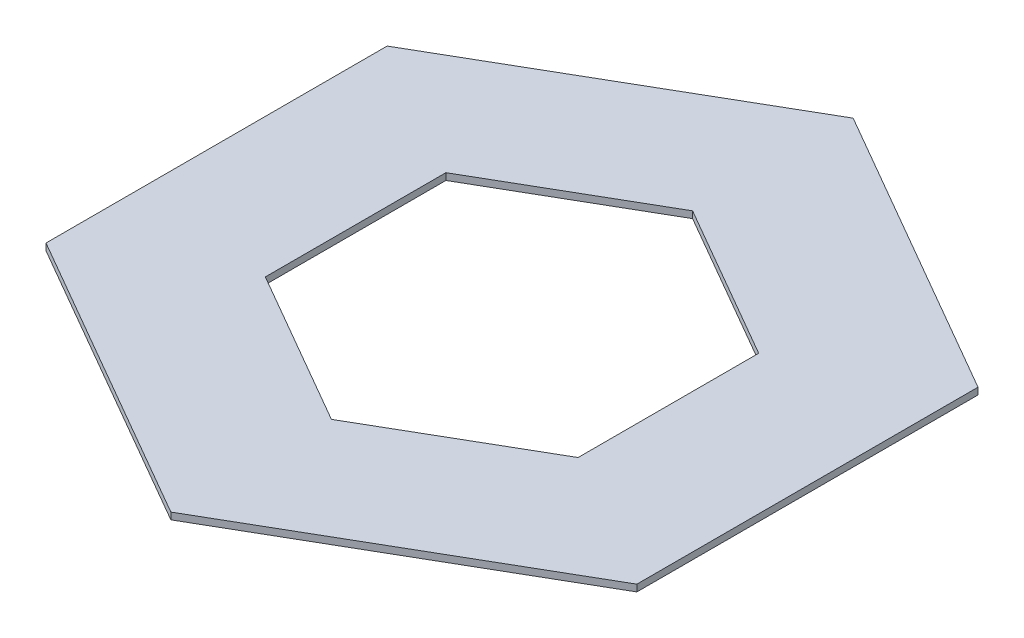
ISO-10303-21;
HEADER;
FILE_DESCRIPTION(('STEP AP214'),'2;1');
FILE_NAME('part.step','',(''),(''),'','','');
FILE_SCHEMA(('AUTOMOTIVE_DESIGN { 1 0 10303 214 1 1 1 1 }'));
ENDSEC;
DATA;
#1=APPLICATION_CONTEXT('core data for automotive mechanical design processes');
#2=APPLICATION_PROTOCOL_DEFINITION('international standard','automotive_design',2000,#1);
#3=PRODUCT_CONTEXT('',#1,'mechanical');
#4=PRODUCT('Part','Part','',(#3));
#5=PRODUCT_RELATED_PRODUCT_CATEGORY('part','',(#4));
#6=PRODUCT_DEFINITION_FORMATION('','',#4);
#7=PRODUCT_DEFINITION_CONTEXT('part definition',#1,'design');
#8=PRODUCT_DEFINITION('design','',#6,#7);
#9=PRODUCT_DEFINITION_SHAPE('','',#8);
#10=(LENGTH_UNIT() NAMED_UNIT(*) SI_UNIT(.MILLI.,.METRE.));
#11=(NAMED_UNIT(*) PLANE_ANGLE_UNIT() SI_UNIT($,.RADIAN.));
#12=(NAMED_UNIT(*) SI_UNIT($,.STERADIAN.) SOLID_ANGLE_UNIT());
#13=UNCERTAINTY_MEASURE_WITH_UNIT(LENGTH_MEASURE(1.E-05),#10,'distance_accuracy_value','');
#14=(GEOMETRIC_REPRESENTATION_CONTEXT(3) GLOBAL_UNCERTAINTY_ASSIGNED_CONTEXT((#13)) GLOBAL_UNIT_ASSIGNED_CONTEXT((#10,
#11,#12)) REPRESENTATION_CONTEXT('',''));
#15=CARTESIAN_POINT('',(0.,0.,0.));
#16=DIRECTION('',(0.,0.,1.));
#17=DIRECTION('',(1.,0.,0.));
#18=AXIS2_PLACEMENT_3D('',#15,#16,#17);
#19=CARTESIAN_POINT('',(-12.2247627531244,1.,-43.3100674178072));
#20=DIRECTION('',(0.5,0.,0.866025403784439));
#21=DIRECTION('',(0.866025403784439,0.,-0.5));
#22=AXIS2_PLACEMENT_3D('',#19,#20,#21);
#23=PLANE('',#22);
#24=DIRECTION('',(-0.866025403784439,0.,0.5));
#25=VECTOR('',#24,1.);
#26=CARTESIAN_POINT('',(-12.2247627531244,0.,-43.3100674178072));
#27=LINE('',#26,#25);
#28=CARTESIAN_POINT('',(0.,0.,-50.3680374841029));
#29=VERTEX_POINT('',#28);
#30=CARTESIAN_POINT('',(-43.62,0.,-25.1840187420514));
#31=VERTEX_POINT('',#30);
#32=EDGE_CURVE('E190',#29,#31,#27,.T.);
#33=ORIENTED_EDGE('',*,*,#32,.T.);
#34=DIRECTION('',(0.,-1.,0.));
#35=VECTOR('',#34,1.);
#36=CARTESIAN_POINT('',(-43.62,1.,-25.1840187420514));
#37=LINE('',#36,#35);
#38=CARTESIAN_POINT('',(-43.62,1.,-25.1840187420514));
#39=VERTEX_POINT('',#38);
#40=EDGE_CURVE('E11',#39,#31,#37,.T.);
#41=ORIENTED_EDGE('',*,*,#40,.F.);
#42=DIRECTION('',(-0.866025403784438,0.,0.5));
#43=VECTOR('',#42,1.);
#44=CARTESIAN_POINT('',(-12.2247627531244,1.,-43.3100674178072));
#45=LINE('',#44,#43);
#46=CARTESIAN_POINT('',(0.,1.,-50.3680374841029));
#47=VERTEX_POINT('',#46);
#48=EDGE_CURVE('E202',#47,#39,#45,.T.);
#49=ORIENTED_EDGE('',*,*,#48,.F.);
#50=DIRECTION('',(0.,-1.,0.));
#51=VECTOR('',#50,1.);
#52=CARTESIAN_POINT('',(0.,1.,-50.3680374841029));
#53=LINE('',#52,#51);
#54=EDGE_CURVE('E221',#47,#29,#53,.T.);
#55=ORIENTED_EDGE('',*,*,#54,.T.);
#56=EDGE_LOOP('',(#33,#41,#49,#55));
#57=FACE_BOUND('',#56,.T.);
#58=ADVANCED_FACE('F42',(#57),#23,.F.);
#59=CARTESIAN_POINT('',(-43.62,1.,-11.06807860946));
#60=DIRECTION('',(1.,0.,0.));
#61=DIRECTION('',(0.,0.,-1.));
#62=AXIS2_PLACEMENT_3D('',#59,#60,#61);
#63=PLANE('',#62);
#64=DIRECTION('',(0.,0.,1.));
#65=VECTOR('',#64,1.);
#66=CARTESIAN_POINT('',(-43.62,0.,-11.06807860946));
#67=LINE('',#66,#65);
#68=CARTESIAN_POINT('',(-43.62,0.,25.1840187420515));
#69=VERTEX_POINT('',#68);
#70=EDGE_CURVE('E225',#31,#69,#67,.T.);
#71=ORIENTED_EDGE('',*,*,#70,.T.);
#72=DIRECTION('',(0.,-1.,0.));
#73=VECTOR('',#72,1.);
#74=CARTESIAN_POINT('',(-43.62,1.,25.1840187420515));
#75=LINE('',#74,#73);
#76=CARTESIAN_POINT('',(-43.62,1.,25.1840187420515));
#77=VERTEX_POINT('',#76);
#78=EDGE_CURVE('E50',#77,#69,#75,.T.);
#79=ORIENTED_EDGE('',*,*,#78,.F.);
#80=DIRECTION('',(0.,0.,1.));
#81=VECTOR('',#80,1.);
#82=CARTESIAN_POINT('',(-43.62,1.,-11.06807860946));
#83=LINE('',#82,#81);
#84=EDGE_CURVE('E205',#39,#77,#83,.T.);
#85=ORIENTED_EDGE('',*,*,#84,.F.);
#86=ORIENTED_EDGE('',*,*,#40,.T.);
#87=EDGE_LOOP('',(#71,#79,#85,#86));
#88=FACE_BOUND('',#87,.T.);
#89=ADVANCED_FACE('F267',(#88),#63,.F.);
#90=CARTESIAN_POINT('',(-31.3952372468755,1.,32.2419888083473));
#91=DIRECTION('',(0.5,0.,-0.866025403784439));
#92=DIRECTION('',(-0.866025403784439,0.,-0.5));
#93=AXIS2_PLACEMENT_3D('',#90,#91,#92);
#94=PLANE('',#93);
#95=DIRECTION('',(0.866025403784439,0.,0.5));
#96=VECTOR('',#95,1.);
#97=CARTESIAN_POINT('',(-31.3952372468755,0.,32.2419888083473));
#98=LINE('',#97,#96);
#99=CARTESIAN_POINT('',(0.,0.,50.368037484103));
#100=VERTEX_POINT('',#99);
#101=EDGE_CURVE('E229',#69,#100,#98,.T.);
#102=ORIENTED_EDGE('',*,*,#101,.T.);
#103=DIRECTION('',(0.,-1.,0.));
#104=VECTOR('',#103,1.);
#105=CARTESIAN_POINT('',(0.,1.,50.368037484103));
#106=LINE('',#105,#104);
#107=CARTESIAN_POINT('',(0.,1.,50.368037484103));
#108=VERTEX_POINT('',#107);
#109=EDGE_CURVE('E255',#108,#100,#106,.T.);
#110=ORIENTED_EDGE('',*,*,#109,.F.);
#111=DIRECTION('',(0.866025403784439,0.,0.5));
#112=VECTOR('',#111,1.);
#113=CARTESIAN_POINT('',(-31.3952372468755,1.,32.2419888083473));
#114=LINE('',#113,#112);
#115=EDGE_CURVE('E209',#77,#108,#114,.T.);
#116=ORIENTED_EDGE('',*,*,#115,.F.);
#117=ORIENTED_EDGE('',*,*,#78,.T.);
#118=EDGE_LOOP('',(#102,#110,#116,#117));
#119=FACE_BOUND('',#118,.T.);
#120=ADVANCED_FACE('F263',(#119),#94,.F.);
#121=CARTESIAN_POINT('',(12.2247627531247,1.,43.3100674178072));
#122=DIRECTION('',(-0.5,0.,-0.866025403784439));
#123=DIRECTION('',(-0.866025403784439,0.,0.5));
#124=AXIS2_PLACEMENT_3D('',#121,#122,#123);
#125=PLANE('',#124);
#126=DIRECTION('',(0.866025403784439,0.,-0.5));
#127=VECTOR('',#126,1.);
#128=CARTESIAN_POINT('',(12.2247627531247,0.,43.3100674178072));
#129=LINE('',#128,#127);
#130=CARTESIAN_POINT('',(43.6199999999999,0.,25.1840187420516));
#131=VERTEX_POINT('',#130);
#132=EDGE_CURVE('E233',#100,#131,#129,.T.);
#133=ORIENTED_EDGE('',*,*,#132,.T.);
#134=DIRECTION('',(0.,-1.,0.));
#135=VECTOR('',#134,1.);
#136=CARTESIAN_POINT('',(43.6199999999999,1.,25.1840187420516));
#137=LINE('',#136,#135);
#138=CARTESIAN_POINT('',(43.6199999999999,1.,25.1840187420516));
#139=VERTEX_POINT('',#138);
#140=EDGE_CURVE('E251',#139,#131,#137,.T.);
#141=ORIENTED_EDGE('',*,*,#140,.F.);
#142=DIRECTION('',(0.866025403784439,0.,-0.5));
#143=VECTOR('',#142,1.);
#144=CARTESIAN_POINT('',(12.2247627531247,1.,43.3100674178072));
#145=LINE('',#144,#143);
#146=EDGE_CURVE('E212',#108,#139,#145,.T.);
#147=ORIENTED_EDGE('',*,*,#146,.F.);
#148=ORIENTED_EDGE('',*,*,#109,.T.);
#149=EDGE_LOOP('',(#133,#141,#147,#148));
#150=FACE_BOUND('',#149,.T.);
#151=ADVANCED_FACE('F284',(#150),#125,.F.);
#152=CARTESIAN_POINT('',(43.6199999999999,1.,11.0680786094603));
#153=DIRECTION('',(-1.,0.,0.));
#154=DIRECTION('',(0.,0.,1.));
#155=AXIS2_PLACEMENT_3D('',#152,#153,#154);
#156=PLANE('',#155);
#157=DIRECTION('',(0.,0.,-1.));
#158=VECTOR('',#157,1.);
#159=CARTESIAN_POINT('',(43.6199999999999,0.,11.0680786094603));
#160=LINE('',#159,#158);
#161=CARTESIAN_POINT('',(43.6199999999999,0.,-25.1840187420514));
#162=VERTEX_POINT('',#161);
#163=EDGE_CURVE('E237',#131,#162,#160,.T.);
#164=ORIENTED_EDGE('',*,*,#163,.T.);
#165=DIRECTION('',(0.,-1.,0.));
#166=VECTOR('',#165,1.);
#167=CARTESIAN_POINT('',(43.6199999999999,1.,-25.1840187420514));
#168=LINE('',#167,#166);
#169=CARTESIAN_POINT('',(43.6199999999999,1.,-25.1840187420514));
#170=VERTEX_POINT('',#169);
#171=EDGE_CURVE('E247',#170,#162,#168,.T.);
#172=ORIENTED_EDGE('',*,*,#171,.F.);
#173=DIRECTION('',(0.,0.,-1.));
#174=VECTOR('',#173,1.);
#175=CARTESIAN_POINT('',(43.6199999999999,1.,11.0680786094603));
#176=LINE('',#175,#174);
#177=EDGE_CURVE('E215',#139,#170,#176,.T.);
#178=ORIENTED_EDGE('',*,*,#177,.F.);
#179=ORIENTED_EDGE('',*,*,#140,.T.);
#180=EDGE_LOOP('',(#164,#172,#178,#179));
#181=FACE_BOUND('',#180,.T.);
#182=ADVANCED_FACE('F279',(#181),#156,.F.);
#183=CARTESIAN_POINT('',(31.3952372468757,1.,-32.241988808347));
#184=DIRECTION('',(-0.5,0.,0.866025403784439));
#185=DIRECTION('',(0.866025403784439,0.,0.5));
#186=AXIS2_PLACEMENT_3D('',#183,#184,#185);
#187=PLANE('',#186);
#188=DIRECTION('',(-0.866025403784439,0.,-0.5));
#189=VECTOR('',#188,1.);
#190=CARTESIAN_POINT('',(31.3952372468757,0.,-32.241988808347));
#191=LINE('',#190,#189);
#192=EDGE_CURVE('E206',#162,#29,#191,.T.);
#193=ORIENTED_EDGE('',*,*,#192,.T.);
#194=ORIENTED_EDGE('',*,*,#54,.F.);
#195=DIRECTION('',(-0.866025403784439,0.,-0.5));
#196=VECTOR('',#195,1.);
#197=CARTESIAN_POINT('',(31.3952372468757,1.,-32.241988808347));
#198=LINE('',#197,#196);
#199=EDGE_CURVE('E218',#170,#47,#198,.T.);
#200=ORIENTED_EDGE('',*,*,#199,.F.);
#201=ORIENTED_EDGE('',*,*,#171,.T.);
#202=EDGE_LOOP('',(#193,#194,#200,#201));
#203=FACE_BOUND('',#202,.T.);
#204=ADVANCED_FACE('F276',(#203),#187,.F.);
#205=CARTESIAN_POINT('',(0.,1.,0.));
#206=DIRECTION('',(0.,1.,0.));
#207=DIRECTION('',(0.,0.,1.));
#208=AXIS2_PLACEMENT_3D('',#205,#206,#207);
#209=PLANE('',#208);
#210=DIRECTION('',(0.,0.,1.));
#211=VECTOR('',#210,1.);
#212=CARTESIAN_POINT('',(23.0916574203555,1.,-13.3319746276764));
#213=LINE('',#212,#211);
#214=CARTESIAN_POINT('',(23.0916574203555,1.,-13.3319746276764));
#215=VERTEX_POINT('',#214);
#216=CARTESIAN_POINT('',(23.0916574203553,1.,13.3319746276769));
#217=VERTEX_POINT('',#216);
#218=EDGE_CURVE('E133',#215,#217,#213,.T.);
#219=ORIENTED_EDGE('',*,*,#218,.T.);
#220=DIRECTION('',(-0.866025403784441,0.,0.499999999999996));
#221=VECTOR('',#220,1.);
#222=CARTESIAN_POINT('',(23.0916574203553,1.,13.3319746276769));
#223=LINE('',#222,#221);
#224=CARTESIAN_POINT('',(-1.57859836313889E-13,1.,26.6639492553536));
#225=VERTEX_POINT('',#224);
#226=EDGE_CURVE('E143',#217,#225,#223,.T.);
#227=ORIENTED_EDGE('',*,*,#226,.T.);
#228=DIRECTION('',(-0.866025403784435,0.,-0.500000000000006));
#229=VECTOR('',#228,1.);
#230=CARTESIAN_POINT('',(-1.57859836313889E-13,1.,26.6639492553535));
#231=LINE('',#230,#229);
#232=CARTESIAN_POINT('',(-23.0916574203554,1.,13.3319746276766));
#233=VERTEX_POINT('',#232);
#234=EDGE_CURVE('E57',#225,#233,#231,.T.);
#235=ORIENTED_EDGE('',*,*,#234,.T.);
#236=DIRECTION('',(0.,0.,-1.));
#237=VECTOR('',#236,1.);
#238=CARTESIAN_POINT('',(-23.0916574203554,1.,13.3319746276766));
#239=LINE('',#238,#237);
#240=CARTESIAN_POINT('',(-23.0916574203552,1.,-13.331974627677));
#241=VERTEX_POINT('',#240);
#242=EDGE_CURVE('E162',#233,#241,#239,.T.);
#243=ORIENTED_EDGE('',*,*,#242,.T.);
#244=DIRECTION('',(0.866025403784444,0.,-0.49999999999999));
#245=VECTOR('',#244,1.);
#246=CARTESIAN_POINT('',(-23.0916574203552,1.,-13.331974627677));
#247=LINE('',#246,#245);
#248=CARTESIAN_POINT('',(3.45209971719385E-13,1.,-26.6639492553535));
#249=VERTEX_POINT('',#248);
#250=EDGE_CURVE('E166',#241,#249,#247,.T.);
#251=ORIENTED_EDGE('',*,*,#250,.T.);
#252=DIRECTION('',(0.866025403784431,0.,0.500000000000012));
#253=VECTOR('',#252,1.);
#254=CARTESIAN_POINT('',(3.45209971719385E-13,1.,-26.6639492553535));
#255=LINE('',#254,#253);
#256=EDGE_CURVE('E140',#249,#215,#255,.T.);
#257=ORIENTED_EDGE('',*,*,#256,.T.);
#258=EDGE_LOOP('',(#219,#227,#235,#243,#251,#257));
#259=FACE_BOUND('',#258,.T.);
#260=ORIENTED_EDGE('',*,*,#48,.T.);
#261=ORIENTED_EDGE('',*,*,#84,.T.);
#262=ORIENTED_EDGE('',*,*,#115,.T.);
#263=ORIENTED_EDGE('',*,*,#146,.T.);
#264=ORIENTED_EDGE('',*,*,#177,.T.);
#265=ORIENTED_EDGE('',*,*,#199,.T.);
#266=EDGE_LOOP('',(#260,#261,#262,#263,#264,#265));
#267=FACE_BOUND('',#266,.T.);
#268=ADVANCED_FACE('F148',(#259,#267),#209,.T.);
#269=CARTESIAN_POINT('',(0.,0.,0.));
#270=DIRECTION('',(0.,1.,0.));
#271=DIRECTION('',(0.,0.,1.));
#272=AXIS2_PLACEMENT_3D('',#269,#270,#271);
#273=PLANE('',#272);
#274=DIRECTION('',(-0.866025403784441,0.,0.499999999999996));
#275=VECTOR('',#274,1.);
#276=CARTESIAN_POINT('',(23.0916574203553,0.,13.3319746276769));
#277=LINE('',#276,#275);
#278=CARTESIAN_POINT('',(23.0916574203553,0.,13.3319746276769));
#279=VERTEX_POINT('',#278);
#280=CARTESIAN_POINT('',(-1.57859836313889E-13,0.,26.6639492553535));
#281=VERTEX_POINT('',#280);
#282=EDGE_CURVE('E173',#279,#281,#277,.T.);
#283=ORIENTED_EDGE('',*,*,#282,.F.);
#284=DIRECTION('',(0.,0.,1.));
#285=VECTOR('',#284,1.);
#286=CARTESIAN_POINT('',(23.0916574203555,0.,-13.3319746276764));
#287=LINE('',#286,#285);
#288=CARTESIAN_POINT('',(23.0916574203555,0.,-13.3319746276764));
#289=VERTEX_POINT('',#288);
#290=EDGE_CURVE('E65',#289,#279,#287,.T.);
#291=ORIENTED_EDGE('',*,*,#290,.F.);
#292=DIRECTION('',(0.866025403784431,0.,0.500000000000012));
#293=VECTOR('',#292,1.);
#294=CARTESIAN_POINT('',(3.45209971719385E-13,0.,-26.6639492553535));
#295=LINE('',#294,#293);
#296=CARTESIAN_POINT('',(3.45209971719385E-13,0.,-26.6639492553535));
#297=VERTEX_POINT('',#296);
#298=EDGE_CURVE('E153',#297,#289,#295,.T.);
#299=ORIENTED_EDGE('',*,*,#298,.F.);
#300=DIRECTION('',(0.866025403784444,0.,-0.49999999999999));
#301=VECTOR('',#300,1.);
#302=CARTESIAN_POINT('',(-23.0916574203552,0.,-13.331974627677));
#303=LINE('',#302,#301);
#304=CARTESIAN_POINT('',(-23.0916574203552,0.,-13.331974627677));
#305=VERTEX_POINT('',#304);
#306=EDGE_CURVE('E157',#305,#297,#303,.T.);
#307=ORIENTED_EDGE('',*,*,#306,.F.);
#308=DIRECTION('',(0.,0.,-1.));
#309=VECTOR('',#308,1.);
#310=CARTESIAN_POINT('',(-23.0916574203554,0.,13.3319746276766));
#311=LINE('',#310,#309);
#312=CARTESIAN_POINT('',(-23.0916574203554,0.,13.3319746276766));
#313=VERTEX_POINT('',#312);
#314=EDGE_CURVE('E180',#313,#305,#311,.T.);
#315=ORIENTED_EDGE('',*,*,#314,.F.);
#316=DIRECTION('',(-0.866025403784435,0.,-0.500000000000006));
#317=VECTOR('',#316,1.);
#318=CARTESIAN_POINT('',(-1.57859836313889E-13,0.,26.6639492553535));
#319=LINE('',#318,#317);
#320=EDGE_CURVE('E176',#281,#313,#319,.T.);
#321=ORIENTED_EDGE('',*,*,#320,.F.);
#322=EDGE_LOOP('',(#283,#291,#299,#307,#315,#321));
#323=FACE_BOUND('',#322,.T.);
#324=ORIENTED_EDGE('',*,*,#32,.F.);
#325=ORIENTED_EDGE('',*,*,#192,.F.);
#326=ORIENTED_EDGE('',*,*,#163,.F.);
#327=ORIENTED_EDGE('',*,*,#132,.F.);
#328=ORIENTED_EDGE('',*,*,#101,.F.);
#329=ORIENTED_EDGE('',*,*,#70,.F.);
#330=EDGE_LOOP('',(#324,#325,#326,#327,#328,#329));
#331=FACE_BOUND('',#330,.T.);
#332=ADVANCED_FACE('F270',(#323,#331),#273,.F.);
#333=CARTESIAN_POINT('',(23.0916574203555,1.,-13.3319746276764));
#334=DIRECTION('',(1.,0.,0.));
#335=DIRECTION('',(0.,0.,-1.));
#336=AXIS2_PLACEMENT_3D('',#333,#334,#335);
#337=PLANE('',#336);
#338=ORIENTED_EDGE('',*,*,#290,.T.);
#339=DIRECTION('',(0.,-1.,0.));
#340=VECTOR('',#339,1.);
#341=CARTESIAN_POINT('',(23.0916574203553,1.,13.3319746276769));
#342=LINE('',#341,#340);
#343=EDGE_CURVE('E129',#217,#279,#342,.T.);
#344=ORIENTED_EDGE('',*,*,#343,.F.);
#345=ORIENTED_EDGE('',*,*,#218,.F.);
#346=DIRECTION('',(0.,-1.,0.));
#347=VECTOR('',#346,1.);
#348=CARTESIAN_POINT('',(23.0916574203555,1.,-13.3319746276764));
#349=LINE('',#348,#347);
#350=EDGE_CURVE('E187',#215,#289,#349,.T.);
#351=ORIENTED_EDGE('',*,*,#350,.T.);
#352=EDGE_LOOP('',(#338,#344,#345,#351));
#353=FACE_BOUND('',#352,.T.);
#354=ADVANCED_FACE('F131',(#353),#337,.F.);
#355=CARTESIAN_POINT('',(3.45209971719385E-13,1.,-26.6639492553535));
#356=DIRECTION('',(0.500000000000012,0.,-0.866025403784431));
#357=DIRECTION('',(-0.866025403784432,0.,-0.500000000000012));
#358=AXIS2_PLACEMENT_3D('',#355,#356,#357);
#359=PLANE('',#358);
#360=ORIENTED_EDGE('',*,*,#298,.T.);
#361=ORIENTED_EDGE('',*,*,#350,.F.);
#362=ORIENTED_EDGE('',*,*,#256,.F.);
#363=DIRECTION('',(0.,-1.,0.));
#364=VECTOR('',#363,1.);
#365=CARTESIAN_POINT('',(3.45209971719385E-13,1.,-26.6639492553535));
#366=LINE('',#365,#364);
#367=EDGE_CURVE('E191',#249,#297,#366,.T.);
#368=ORIENTED_EDGE('',*,*,#367,.T.);
#369=EDGE_LOOP('',(#360,#361,#362,#368));
#370=FACE_BOUND('',#369,.T.);
#371=ADVANCED_FACE('F334',(#370),#359,.F.);
#372=CARTESIAN_POINT('',(-23.0916574203552,1.,-13.331974627677));
#373=DIRECTION('',(-0.49999999999999,0.,-0.866025403784445));
#374=DIRECTION('',(-0.866025403784445,0.,0.49999999999999));
#375=AXIS2_PLACEMENT_3D('',#372,#373,#374);
#376=PLANE('',#375);
#377=ORIENTED_EDGE('',*,*,#306,.T.);
#378=ORIENTED_EDGE('',*,*,#367,.F.);
#379=ORIENTED_EDGE('',*,*,#250,.F.);
#380=DIRECTION('',(0.,-1.,0.));
#381=VECTOR('',#380,1.);
#382=CARTESIAN_POINT('',(-23.0916574203552,1.,-13.331974627677));
#383=LINE('',#382,#381);
#384=EDGE_CURVE('E194',#241,#305,#383,.T.);
#385=ORIENTED_EDGE('',*,*,#384,.T.);
#386=EDGE_LOOP('',(#377,#378,#379,#385));
#387=FACE_BOUND('',#386,.T.);
#388=ADVANCED_FACE('F339',(#387),#376,.F.);
#389=CARTESIAN_POINT('',(-23.0916574203554,1.,13.3319746276766));
#390=DIRECTION('',(-1.,0.,0.));
#391=DIRECTION('',(0.,0.,1.));
#392=AXIS2_PLACEMENT_3D('',#389,#390,#391);
#393=PLANE('',#392);
#394=ORIENTED_EDGE('',*,*,#314,.T.);
#395=ORIENTED_EDGE('',*,*,#384,.F.);
#396=ORIENTED_EDGE('',*,*,#242,.F.);
#397=DIRECTION('',(0.,-1.,0.));
#398=VECTOR('',#397,1.);
#399=CARTESIAN_POINT('',(-23.0916574203554,1.,13.3319746276766));
#400=LINE('',#399,#398);
#401=EDGE_CURVE('E197',#233,#313,#400,.T.);
#402=ORIENTED_EDGE('',*,*,#401,.T.);
#403=EDGE_LOOP('',(#394,#395,#396,#402));
#404=FACE_BOUND('',#403,.T.);
#405=ADVANCED_FACE('F347',(#404),#393,.F.);
#406=CARTESIAN_POINT('',(-1.57859836313889E-13,1.,26.6639492553535));
#407=DIRECTION('',(-0.500000000000006,0.,0.866025403784435));
#408=DIRECTION('',(0.866025403784435,0.,0.500000000000006));
#409=AXIS2_PLACEMENT_3D('',#406,#407,#408);
#410=PLANE('',#409);
#411=ORIENTED_EDGE('',*,*,#320,.T.);
#412=ORIENTED_EDGE('',*,*,#401,.F.);
#413=ORIENTED_EDGE('',*,*,#234,.F.);
#414=DIRECTION('',(0.,-1.,0.));
#415=VECTOR('',#414,1.);
#416=CARTESIAN_POINT('',(-1.57859836313889E-13,1.,26.6639492553535));
#417=LINE('',#416,#415);
#418=EDGE_CURVE('E139',#225,#281,#417,.T.);
#419=ORIENTED_EDGE('',*,*,#418,.T.);
#420=EDGE_LOOP('',(#411,#412,#413,#419));
#421=FACE_BOUND('',#420,.T.);
#422=ADVANCED_FACE('F355',(#421),#410,.F.);
#423=CARTESIAN_POINT('',(23.0916574203553,1.,13.3319746276769));
#424=DIRECTION('',(0.499999999999996,0.,0.866025403784441));
#425=DIRECTION('',(0.866025403784441,0.,-0.499999999999996));
#426=AXIS2_PLACEMENT_3D('',#423,#424,#425);
#427=PLANE('',#426);
#428=ORIENTED_EDGE('',*,*,#282,.T.);
#429=ORIENTED_EDGE('',*,*,#418,.F.);
#430=ORIENTED_EDGE('',*,*,#226,.F.);
#431=ORIENTED_EDGE('',*,*,#343,.T.);
#432=EDGE_LOOP('',(#428,#429,#430,#431));
#433=FACE_BOUND('',#432,.T.);
#434=ADVANCED_FACE('F144',(#433),#427,.F.);
#435=CLOSED_SHELL('',(#58,#89,#120,#151,#182,#204,#268,#332,#354,#371,#388,#405,#422,#434));
#436=MANIFOLD_SOLID_BREP('B2',#435);
#437=ADVANCED_BREP_SHAPE_REPRESENTATION('',(#18,#436),#14);
#438=SHAPE_DEFINITION_REPRESENTATION(#9,#437);
ENDSEC;
END-ISO-10303-21;
